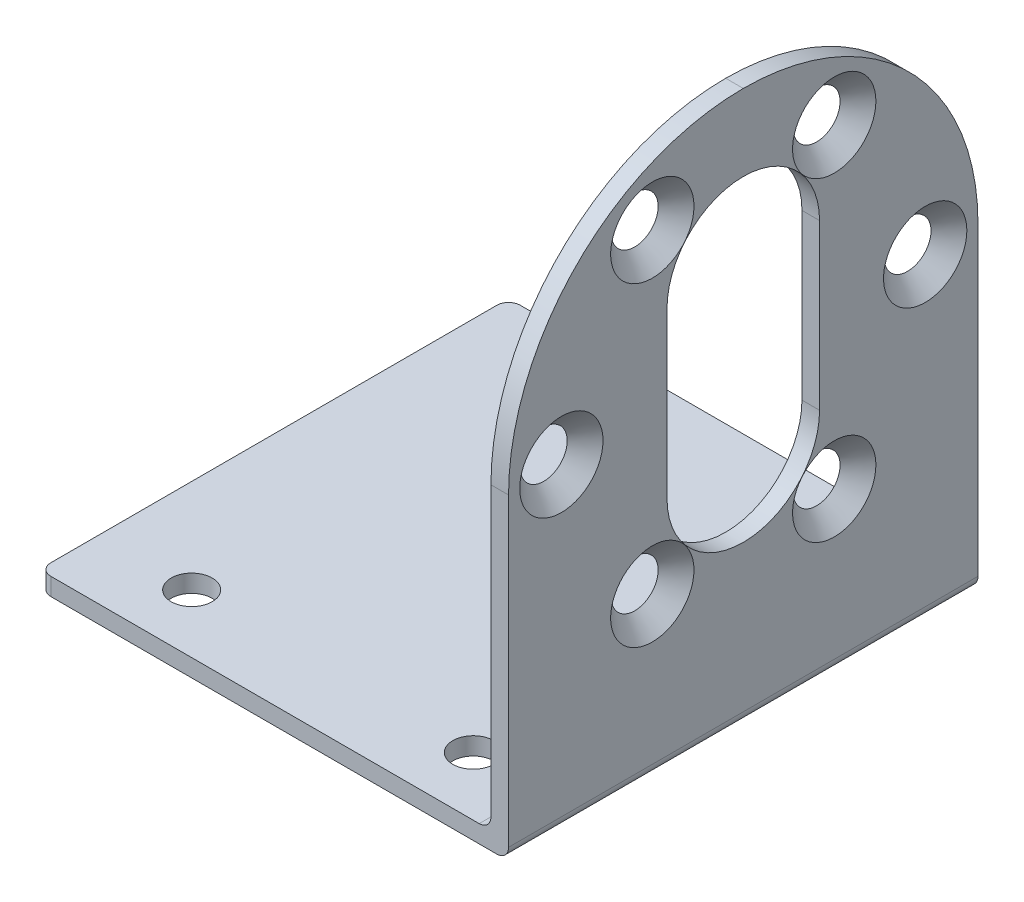
ISO-10303-21;
HEADER;
FILE_DESCRIPTION(('STEP AP214'),'2;1');
FILE_NAME('part.step','',(''),(''),'','','');
FILE_SCHEMA(('AUTOMOTIVE_DESIGN { 1 0 10303 214 1 1 1 1 }'));
ENDSEC;
DATA;
#1=APPLICATION_CONTEXT('core data for automotive mechanical design processes');
#2=APPLICATION_PROTOCOL_DEFINITION('international standard','automotive_design',2000,#1);
#3=PRODUCT_CONTEXT('',#1,'mechanical');
#4=PRODUCT('Part','Part','',(#3));
#5=PRODUCT_RELATED_PRODUCT_CATEGORY('part','',(#4));
#6=PRODUCT_DEFINITION_FORMATION('','',#4);
#7=PRODUCT_DEFINITION_CONTEXT('part definition',#1,'design');
#8=PRODUCT_DEFINITION('design','',#6,#7);
#9=PRODUCT_DEFINITION_SHAPE('','',#8);
#10=(LENGTH_UNIT() NAMED_UNIT(*) SI_UNIT(.MILLI.,.METRE.));
#11=(NAMED_UNIT(*) PLANE_ANGLE_UNIT() SI_UNIT($,.RADIAN.));
#12=(NAMED_UNIT(*) SI_UNIT($,.STERADIAN.) SOLID_ANGLE_UNIT());
#13=UNCERTAINTY_MEASURE_WITH_UNIT(LENGTH_MEASURE(1.E-05),#10,'distance_accuracy_value','');
#14=(GEOMETRIC_REPRESENTATION_CONTEXT(3) GLOBAL_UNCERTAINTY_ASSIGNED_CONTEXT((#13)) GLOBAL_UNIT_ASSIGNED_CONTEXT((#10,
#11,#12)) REPRESENTATION_CONTEXT('',''));
#15=CARTESIAN_POINT('',(0.,0.,0.));
#16=DIRECTION('',(0.,0.,1.));
#17=DIRECTION('',(1.,0.,0.));
#18=AXIS2_PLACEMENT_3D('',#15,#16,#17);
#19=CARTESIAN_POINT('',(20.,1.5,20.));
#20=DIRECTION('',(-1.,0.,0.));
#21=DIRECTION('',(0.,0.,1.));
#22=AXIS2_PLACEMENT_3D('',#19,#20,#21);
#23=PLANE('',#22);
#24=CARTESIAN_POINT('',(20.,27.,-15.5));
#25=DIRECTION('',(1.,0.,0.));
#26=DIRECTION('',(0.,0.,-1.));
#27=AXIS2_PLACEMENT_3D('',#24,#25,#26);
#28=CIRCLE('',#27,3.55);
#29=CARTESIAN_POINT('',(20.,27.,-19.05));
#30=VERTEX_POINT('',#29);
#31=EDGE_CURVE('E303',#30,#30,#28,.T.);
#32=ORIENTED_EDGE('',*,*,#31,.F.);
#33=EDGE_LOOP('',(#32));
#34=FACE_BOUND('',#33,.T.);
#35=CARTESIAN_POINT('',(20.,40.4233937586587,-7.75000000000017));
#36=DIRECTION('',(1.,0.,0.));
#37=DIRECTION('',(0.,0.,-1.));
#38=AXIS2_PLACEMENT_3D('',#35,#36,#37);
#39=CIRCLE('',#38,3.55);
#40=CARTESIAN_POINT('',(20.,40.4233937586587,-11.3000000000002));
#41=VERTEX_POINT('',#40);
#42=EDGE_CURVE('E298',#41,#41,#39,.T.);
#43=ORIENTED_EDGE('',*,*,#42,.F.);
#44=EDGE_LOOP('',(#43));
#45=FACE_BOUND('',#44,.T.);
#46=CARTESIAN_POINT('',(20.,40.4233937586589,7.74999999999987));
#47=DIRECTION('',(1.,0.,0.));
#48=DIRECTION('',(0.,0.,-1.));
#49=AXIS2_PLACEMENT_3D('',#46,#47,#48);
#50=CIRCLE('',#49,3.55);
#51=CARTESIAN_POINT('',(20.,40.4233937586589,4.19999999999987));
#52=VERTEX_POINT('',#51);
#53=EDGE_CURVE('E293',#52,#52,#50,.T.);
#54=ORIENTED_EDGE('',*,*,#53,.F.);
#55=EDGE_LOOP('',(#54));
#56=FACE_BOUND('',#55,.T.);
#57=CARTESIAN_POINT('',(20.,27.0000000000001,15.5));
#58=DIRECTION('',(1.,0.,0.));
#59=DIRECTION('',(0.,0.,-1.));
#60=AXIS2_PLACEMENT_3D('',#57,#58,#59);
#61=CIRCLE('',#60,3.55);
#62=CARTESIAN_POINT('',(20.,27.0000000000001,11.95));
#63=VERTEX_POINT('',#62);
#64=EDGE_CURVE('E288',#63,#63,#61,.T.);
#65=ORIENTED_EDGE('',*,*,#64,.F.);
#66=EDGE_LOOP('',(#65));
#67=FACE_BOUND('',#66,.T.);
#68=CARTESIAN_POINT('',(20.,13.5766062413412,7.75000000000007));
#69=DIRECTION('',(1.,0.,0.));
#70=DIRECTION('',(0.,0.,-1.));
#71=AXIS2_PLACEMENT_3D('',#68,#69,#70);
#72=CIRCLE('',#71,3.55);
#73=CARTESIAN_POINT('',(20.,13.5766062413412,4.20000000000007));
#74=VERTEX_POINT('',#73);
#75=EDGE_CURVE('E283',#74,#74,#72,.T.);
#76=ORIENTED_EDGE('',*,*,#75,.F.);
#77=EDGE_LOOP('',(#76));
#78=FACE_BOUND('',#77,.T.);
#79=CARTESIAN_POINT('',(20.,13.5766062413412,-7.74999999999997));
#80=DIRECTION('',(1.,0.,0.));
#81=DIRECTION('',(0.,0.,-1.));
#82=AXIS2_PLACEMENT_3D('',#79,#80,#81);
#83=CIRCLE('',#82,3.55);
#84=CARTESIAN_POINT('',(20.,13.5766062413412,-11.3));
#85=VERTEX_POINT('',#84);
#86=EDGE_CURVE('E282',#85,#85,#83,.T.);
#87=ORIENTED_EDGE('',*,*,#86,.F.);
#88=EDGE_LOOP('',(#87));
#89=FACE_BOUND('',#88,.T.);
#90=DIRECTION('',(0.,1.,0.));
#91=VECTOR('',#90,1.);
#92=CARTESIAN_POINT('',(20.,20.,-6.5));
#93=LINE('',#92,#91);
#94=CARTESIAN_POINT('',(20.,20.,-6.5));
#95=VERTEX_POINT('',#94);
#96=CARTESIAN_POINT('',(20.,34.,-6.5));
#97=VERTEX_POINT('',#96);
#98=EDGE_CURVE('E187',#95,#97,#93,.T.);
#99=ORIENTED_EDGE('',*,*,#98,.F.);
#100=CARTESIAN_POINT('',(20.,20.,0.));
#101=DIRECTION('',(1.,0.,0.));
#102=DIRECTION('',(0.,0.,-1.));
#103=AXIS2_PLACEMENT_3D('',#100,#101,#102);
#104=CIRCLE('',#103,6.5);
#105=CARTESIAN_POINT('',(20.,20.,6.5));
#106=VERTEX_POINT('',#105);
#107=EDGE_CURVE('E163',#106,#95,#104,.T.);
#108=ORIENTED_EDGE('',*,*,#107,.F.);
#109=DIRECTION('',(0.,-1.,0.));
#110=VECTOR('',#109,1.);
#111=CARTESIAN_POINT('',(20.,20.,6.5));
#112=LINE('',#111,#110);
#113=CARTESIAN_POINT('',(20.,34.,6.50000000000001));
#114=VERTEX_POINT('',#113);
#115=EDGE_CURVE('E174',#114,#106,#112,.T.);
#116=ORIENTED_EDGE('',*,*,#115,.F.);
#117=CARTESIAN_POINT('',(20.,34.,0.));
#118=DIRECTION('',(1.,0.,0.));
#119=DIRECTION('',(0.,0.,-1.));
#120=AXIS2_PLACEMENT_3D('',#117,#118,#119);
#121=CIRCLE('',#120,6.5);
#122=EDGE_CURVE('E181',#97,#114,#121,.T.);
#123=ORIENTED_EDGE('',*,*,#122,.F.);
#124=EDGE_LOOP('',(#99,#108,#116,#123));
#125=FACE_BOUND('',#124,.T.);
#126=DIRECTION('',(0.,-1.,0.));
#127=VECTOR('',#126,1.);
#128=CARTESIAN_POINT('',(20.,1.5,20.));
#129=LINE('',#128,#127);
#130=CARTESIAN_POINT('',(20.,27.,20.));
#131=VERTEX_POINT('',#130);
#132=CARTESIAN_POINT('',(20.,1.,20.));
#133=VERTEX_POINT('',#132);
#134=EDGE_CURVE('E248',#131,#133,#129,.T.);
#135=ORIENTED_EDGE('',*,*,#134,.T.);
#136=DIRECTION('',(0.,0.,-1.));
#137=VECTOR('',#136,1.);
#138=CARTESIAN_POINT('',(20.,1.,-20.));
#139=LINE('',#138,#137);
#140=CARTESIAN_POINT('',(20.,1.,-20.));
#141=VERTEX_POINT('',#140);
#142=EDGE_CURVE('E339',#133,#141,#139,.T.);
#143=ORIENTED_EDGE('',*,*,#142,.T.);
#144=DIRECTION('',(0.,-1.,0.));
#145=VECTOR('',#144,1.);
#146=CARTESIAN_POINT('',(20.,1.5,-20.));
#147=LINE('',#146,#145);
#148=CARTESIAN_POINT('',(20.,27.,-20.));
#149=VERTEX_POINT('',#148);
#150=EDGE_CURVE('E261',#149,#141,#147,.T.);
#151=ORIENTED_EDGE('',*,*,#150,.F.);
#152=CARTESIAN_POINT('',(20.,27.,0.));
#153=DIRECTION('',(-1.,0.,0.));
#154=DIRECTION('',(0.,0.,1.));
#155=AXIS2_PLACEMENT_3D('',#152,#153,#154);
#156=CIRCLE('',#155,20.);
#157=CARTESIAN_POINT('',(20.,47.,0.));
#158=VERTEX_POINT('',#157);
#159=EDGE_CURVE('E310',#149,#158,#156,.F.);
#160=ORIENTED_EDGE('',*,*,#159,.T.);
#161=CARTESIAN_POINT('',(20.,27.,0.));
#162=DIRECTION('',(-1.,0.,0.));
#163=DIRECTION('',(0.,0.,1.));
#164=AXIS2_PLACEMENT_3D('',#161,#162,#163);
#165=CIRCLE('',#164,20.);
#166=EDGE_CURVE('E307',#158,#131,#165,.F.);
#167=ORIENTED_EDGE('',*,*,#166,.T.);
#168=EDGE_LOOP('',(#135,#143,#151,#160,#167));
#169=FACE_BOUND('',#168,.T.);
#170=ADVANCED_FACE('F49',(#34,#45,#56,#67,#78,#89,#125,#169),#23,.F.);
#171=CARTESIAN_POINT('',(-20.,1.5,-20.));
#172=DIRECTION('',(0.,0.,1.));
#173=DIRECTION('',(1.,0.,0.));
#174=AXIS2_PLACEMENT_3D('',#171,#172,#173);
#175=PLANE('',#174);
#176=ORIENTED_EDGE('',*,*,#150,.T.);
#177=CARTESIAN_POINT('',(19.,1.,-20.));
#178=DIRECTION('',(0.,0.,1.));
#179=DIRECTION('',(1.,0.,0.));
#180=AXIS2_PLACEMENT_3D('',#177,#178,#179);
#181=CIRCLE('',#180,1.);
#182=CARTESIAN_POINT('',(19.,0.,-20.));
#183=VERTEX_POINT('',#182);
#184=EDGE_CURVE('E346',#141,#183,#181,.F.);
#185=ORIENTED_EDGE('',*,*,#184,.T.);
#186=DIRECTION('',(-1.,0.,0.));
#187=VECTOR('',#186,1.);
#188=CARTESIAN_POINT('',(-20.,0.,-20.));
#189=LINE('',#188,#187);
#190=CARTESIAN_POINT('',(-19.,0.,-20.));
#191=VERTEX_POINT('',#190);
#192=EDGE_CURVE('E231',#183,#191,#189,.T.);
#193=ORIENTED_EDGE('',*,*,#192,.T.);
#194=DIRECTION('',(0.,-1.,0.));
#195=VECTOR('',#194,1.);
#196=CARTESIAN_POINT('',(-19.,1.5,-20.));
#197=LINE('',#196,#195);
#198=CARTESIAN_POINT('',(-19.,1.5,-20.));
#199=VERTEX_POINT('',#198);
#200=EDGE_CURVE('E343',#191,#199,#197,.F.);
#201=ORIENTED_EDGE('',*,*,#200,.T.);
#202=DIRECTION('',(-1.,0.,0.));
#203=VECTOR('',#202,1.);
#204=CARTESIAN_POINT('',(-20.,1.5,-20.));
#205=LINE('',#204,#203);
#206=CARTESIAN_POINT('',(17.5,1.5,-20.));
#207=VERTEX_POINT('',#206);
#208=EDGE_CURVE('E235',#207,#199,#205,.T.);
#209=ORIENTED_EDGE('',*,*,#208,.F.);
#210=CARTESIAN_POINT('',(17.5,2.5,-20.));
#211=DIRECTION('',(0.,0.,1.));
#212=DIRECTION('',(1.,0.,0.));
#213=AXIS2_PLACEMENT_3D('',#210,#211,#212);
#214=CIRCLE('',#213,1.);
#215=CARTESIAN_POINT('',(18.5,2.5,-20.));
#216=VERTEX_POINT('',#215);
#217=EDGE_CURVE('E58',#207,#216,#214,.T.);
#218=ORIENTED_EDGE('',*,*,#217,.T.);
#219=DIRECTION('',(0.,-1.,0.));
#220=VECTOR('',#219,1.);
#221=CARTESIAN_POINT('',(18.5,47.,-20.));
#222=LINE('',#221,#220);
#223=CARTESIAN_POINT('',(18.5,27.,-20.));
#224=VERTEX_POINT('',#223);
#225=EDGE_CURVE('E189',#224,#216,#222,.T.);
#226=ORIENTED_EDGE('',*,*,#225,.F.);
#227=DIRECTION('',(1.,0.,0.));
#228=VECTOR('',#227,1.);
#229=CARTESIAN_POINT('',(-20.,27.,-20.));
#230=LINE('',#229,#228);
#231=EDGE_CURVE('E277',#224,#149,#230,.T.);
#232=ORIENTED_EDGE('',*,*,#231,.T.);
#233=EDGE_LOOP('',(#176,#185,#193,#201,#209,#218,#226,#232));
#234=FACE_BOUND('',#233,.T.);
#235=ADVANCED_FACE('F372',(#234),#175,.F.);
#236=CARTESIAN_POINT('',(-20.,1.5,20.));
#237=DIRECTION('',(1.,0.,0.));
#238=DIRECTION('',(0.,0.,-1.));
#239=AXIS2_PLACEMENT_3D('',#236,#237,#238);
#240=PLANE('',#239);
#241=DIRECTION('',(0.,0.,1.));
#242=VECTOR('',#241,1.);
#243=CARTESIAN_POINT('',(-20.,1.5,20.));
#244=LINE('',#243,#242);
#245=CARTESIAN_POINT('',(-20.,1.5,-19.));
#246=VERTEX_POINT('',#245);
#247=CARTESIAN_POINT('',(-20.,1.5,19.));
#248=VERTEX_POINT('',#247);
#249=EDGE_CURVE('E239',#246,#248,#244,.T.);
#250=ORIENTED_EDGE('',*,*,#249,.F.);
#251=DIRECTION('',(0.,-1.,0.));
#252=VECTOR('',#251,1.);
#253=CARTESIAN_POINT('',(-20.,1.5,-19.));
#254=LINE('',#253,#252);
#255=CARTESIAN_POINT('',(-20.,0.,-19.));
#256=VERTEX_POINT('',#255);
#257=EDGE_CURVE('E365',#246,#256,#254,.T.);
#258=ORIENTED_EDGE('',*,*,#257,.T.);
#259=DIRECTION('',(0.,0.,1.));
#260=VECTOR('',#259,1.);
#261=CARTESIAN_POINT('',(-20.,0.,20.));
#262=LINE('',#261,#260);
#263=CARTESIAN_POINT('',(-20.,0.,19.));
#264=VERTEX_POINT('',#263);
#265=EDGE_CURVE('E252',#256,#264,#262,.T.);
#266=ORIENTED_EDGE('',*,*,#265,.T.);
#267=DIRECTION('',(0.,-1.,0.));
#268=VECTOR('',#267,1.);
#269=CARTESIAN_POINT('',(-20.,1.5,19.));
#270=LINE('',#269,#268);
#271=EDGE_CURVE('E362',#264,#248,#270,.F.);
#272=ORIENTED_EDGE('',*,*,#271,.T.);
#273=EDGE_LOOP('',(#250,#258,#266,#272));
#274=FACE_BOUND('',#273,.T.);
#275=ADVANCED_FACE('F395',(#274),#240,.F.);
#276=CARTESIAN_POINT('',(-20.,1.5,20.));
#277=DIRECTION('',(0.,0.,-1.));
#278=DIRECTION('',(-1.,0.,0.));
#279=AXIS2_PLACEMENT_3D('',#276,#277,#278);
#280=PLANE('',#279);
#281=DIRECTION('',(1.,0.,0.));
#282=VECTOR('',#281,1.);
#283=CARTESIAN_POINT('',(-20.,0.,20.));
#284=LINE('',#283,#282);
#285=CARTESIAN_POINT('',(-19.,0.,20.));
#286=VERTEX_POINT('',#285);
#287=CARTESIAN_POINT('',(19.,0.,20.));
#288=VERTEX_POINT('',#287);
#289=EDGE_CURVE('E240',#286,#288,#284,.T.);
#290=ORIENTED_EDGE('',*,*,#289,.T.);
#291=CARTESIAN_POINT('',(19.,1.,20.));
#292=DIRECTION('',(0.,0.,-1.));
#293=DIRECTION('',(-1.,0.,0.));
#294=AXIS2_PLACEMENT_3D('',#291,#292,#293);
#295=CIRCLE('',#294,1.);
#296=EDGE_CURVE('E359',#288,#133,#295,.F.);
#297=ORIENTED_EDGE('',*,*,#296,.T.);
#298=ORIENTED_EDGE('',*,*,#134,.F.);
#299=DIRECTION('',(-1.,0.,0.));
#300=VECTOR('',#299,1.);
#301=CARTESIAN_POINT('',(-20.,27.,20.));
#302=LINE('',#301,#300);
#303=CARTESIAN_POINT('',(18.5,27.,20.));
#304=VERTEX_POINT('',#303);
#305=EDGE_CURVE('E319',#131,#304,#302,.T.);
#306=ORIENTED_EDGE('',*,*,#305,.T.);
#307=DIRECTION('',(0.,-1.,0.));
#308=VECTOR('',#307,1.);
#309=CARTESIAN_POINT('',(18.5,47.,20.));
#310=LINE('',#309,#308);
#311=CARTESIAN_POINT('',(18.5,2.5,20.));
#312=VERTEX_POINT('',#311);
#313=EDGE_CURVE('E194',#304,#312,#310,.T.);
#314=ORIENTED_EDGE('',*,*,#313,.T.);
#315=CARTESIAN_POINT('',(17.5,2.5,20.));
#316=DIRECTION('',(0.,0.,-1.));
#317=DIRECTION('',(-1.,0.,0.));
#318=AXIS2_PLACEMENT_3D('',#315,#316,#317);
#319=CIRCLE('',#318,1.);
#320=CARTESIAN_POINT('',(17.5,1.5,20.));
#321=VERTEX_POINT('',#320);
#322=EDGE_CURVE('E11',#312,#321,#319,.T.);
#323=ORIENTED_EDGE('',*,*,#322,.T.);
#324=DIRECTION('',(1.,0.,0.));
#325=VECTOR('',#324,1.);
#326=CARTESIAN_POINT('',(-20.,1.5,20.));
#327=LINE('',#326,#325);
#328=CARTESIAN_POINT('',(-19.,1.5,20.));
#329=VERTEX_POINT('',#328);
#330=EDGE_CURVE('E244',#329,#321,#327,.T.);
#331=ORIENTED_EDGE('',*,*,#330,.F.);
#332=DIRECTION('',(0.,-1.,0.));
#333=VECTOR('',#332,1.);
#334=CARTESIAN_POINT('',(-19.,1.5,20.));
#335=LINE('',#334,#333);
#336=EDGE_CURVE('E356',#329,#286,#335,.T.);
#337=ORIENTED_EDGE('',*,*,#336,.T.);
#338=EDGE_LOOP('',(#290,#297,#298,#306,#314,#323,#331,#337));
#339=FACE_BOUND('',#338,.T.);
#340=ADVANCED_FACE('F385',(#339),#280,.F.);
#341=CARTESIAN_POINT('',(0.,1.5,0.));
#342=DIRECTION('',(0.,-1.,0.));
#343=DIRECTION('',(0.,0.,-1.));
#344=AXIS2_PLACEMENT_3D('',#341,#342,#343);
#345=PLANE('',#344);
#346=CARTESIAN_POINT('',(12.,1.5,-15.));
#347=DIRECTION('',(0.,1.,0.));
#348=DIRECTION('',(0.,0.,1.));
#349=AXIS2_PLACEMENT_3D('',#346,#347,#348);
#350=CIRCLE('',#349,1.75);
#351=CARTESIAN_POINT('',(12.,1.5,-13.25));
#352=VERTEX_POINT('',#351);
#353=EDGE_CURVE('E211',#352,#352,#350,.T.);
#354=ORIENTED_EDGE('',*,*,#353,.F.);
#355=EDGE_LOOP('',(#354));
#356=FACE_BOUND('',#355,.T.);
#357=CARTESIAN_POINT('',(-12.,1.5,15.));
#358=DIRECTION('',(0.,1.,0.));
#359=DIRECTION('',(0.,0.,1.));
#360=AXIS2_PLACEMENT_3D('',#357,#358,#359);
#361=CIRCLE('',#360,1.75);
#362=CARTESIAN_POINT('',(-12.,1.5,16.75));
#363=VERTEX_POINT('',#362);
#364=EDGE_CURVE('E220',#363,#363,#361,.T.);
#365=ORIENTED_EDGE('',*,*,#364,.F.);
#366=EDGE_LOOP('',(#365));
#367=FACE_BOUND('',#366,.T.);
#368=CARTESIAN_POINT('',(12.,1.5,15.));
#369=DIRECTION('',(0.,1.,0.));
#370=DIRECTION('',(0.,0.,1.));
#371=AXIS2_PLACEMENT_3D('',#368,#369,#370);
#372=CIRCLE('',#371,1.75);
#373=CARTESIAN_POINT('',(12.,1.5,16.75));
#374=VERTEX_POINT('',#373);
#375=EDGE_CURVE('E203',#374,#374,#372,.T.);
#376=ORIENTED_EDGE('',*,*,#375,.F.);
#377=EDGE_LOOP('',(#376));
#378=FACE_BOUND('',#377,.T.);
#379=CARTESIAN_POINT('',(-12.,1.5,-15.));
#380=DIRECTION('',(0.,1.,0.));
#381=DIRECTION('',(0.,0.,1.));
#382=AXIS2_PLACEMENT_3D('',#379,#380,#381);
#383=CIRCLE('',#382,1.75);
#384=CARTESIAN_POINT('',(-12.,1.5,-13.25));
#385=VERTEX_POINT('',#384);
#386=EDGE_CURVE('E215',#385,#385,#383,.T.);
#387=ORIENTED_EDGE('',*,*,#386,.F.);
#388=EDGE_LOOP('',(#387));
#389=FACE_BOUND('',#388,.T.);
#390=ORIENTED_EDGE('',*,*,#330,.T.);
#391=DIRECTION('',(0.,0.,-1.));
#392=VECTOR('',#391,1.);
#393=CARTESIAN_POINT('',(17.5,1.5,0.));
#394=LINE('',#393,#392);
#395=EDGE_CURVE('E332',#321,#207,#394,.T.);
#396=ORIENTED_EDGE('',*,*,#395,.T.);
#397=ORIENTED_EDGE('',*,*,#208,.T.);
#398=CARTESIAN_POINT('',(-19.,1.5,-19.));
#399=DIRECTION('',(0.,-1.,0.));
#400=DIRECTION('',(0.,0.,-1.));
#401=AXIS2_PLACEMENT_3D('',#398,#399,#400);
#402=CIRCLE('',#401,1.);
#403=EDGE_CURVE('E329',#199,#246,#402,.F.);
#404=ORIENTED_EDGE('',*,*,#403,.T.);
#405=ORIENTED_EDGE('',*,*,#249,.T.);
#406=CARTESIAN_POINT('',(-19.,1.5,19.));
#407=DIRECTION('',(0.,-1.,0.));
#408=DIRECTION('',(0.,0.,-1.));
#409=AXIS2_PLACEMENT_3D('',#406,#407,#408);
#410=CIRCLE('',#409,1.);
#411=EDGE_CURVE('E322',#248,#329,#410,.F.);
#412=ORIENTED_EDGE('',*,*,#411,.T.);
#413=EDGE_LOOP('',(#390,#396,#397,#404,#405,#412));
#414=FACE_BOUND('',#413,.T.);
#415=ADVANCED_FACE('F387',(#356,#367,#378,#389,#414),#345,.F.);
#416=CARTESIAN_POINT('',(0.,0.,0.));
#417=DIRECTION('',(0.,-1.,0.));
#418=DIRECTION('',(0.,0.,-1.));
#419=AXIS2_PLACEMENT_3D('',#416,#417,#418);
#420=PLANE('',#419);
#421=ORIENTED_EDGE('',*,*,#192,.F.);
#422=DIRECTION('',(0.,0.,-1.));
#423=VECTOR('',#422,1.);
#424=CARTESIAN_POINT('',(19.,0.,20.));
#425=LINE('',#424,#423);
#426=EDGE_CURVE('E65',#183,#288,#425,.F.);
#427=ORIENTED_EDGE('',*,*,#426,.T.);
#428=ORIENTED_EDGE('',*,*,#289,.F.);
#429=CARTESIAN_POINT('',(-19.,0.,19.));
#430=DIRECTION('',(0.,-1.,0.));
#431=DIRECTION('',(0.,0.,-1.));
#432=AXIS2_PLACEMENT_3D('',#429,#430,#431);
#433=CIRCLE('',#432,1.);
#434=EDGE_CURVE('E73',#286,#264,#433,.T.);
#435=ORIENTED_EDGE('',*,*,#434,.T.);
#436=ORIENTED_EDGE('',*,*,#265,.F.);
#437=CARTESIAN_POINT('',(-19.,0.,-19.));
#438=DIRECTION('',(0.,-1.,0.));
#439=DIRECTION('',(0.,0.,-1.));
#440=AXIS2_PLACEMENT_3D('',#437,#438,#439);
#441=CIRCLE('',#440,1.);
#442=EDGE_CURVE('E351',#256,#191,#441,.T.);
#443=ORIENTED_EDGE('',*,*,#442,.T.);
#444=EDGE_LOOP('',(#421,#427,#428,#435,#436,#443));
#445=FACE_BOUND('',#444,.T.);
#446=CARTESIAN_POINT('',(12.,0.,-15.));
#447=DIRECTION('',(0.,1.,0.));
#448=DIRECTION('',(0.,0.,1.));
#449=AXIS2_PLACEMENT_3D('',#446,#447,#448);
#450=CIRCLE('',#449,1.75);
#451=CARTESIAN_POINT('',(12.,0.,-13.25));
#452=VERTEX_POINT('',#451);
#453=EDGE_CURVE('E216',#452,#452,#450,.T.);
#454=ORIENTED_EDGE('',*,*,#453,.T.);
#455=EDGE_LOOP('',(#454));
#456=FACE_BOUND('',#455,.T.);
#457=CARTESIAN_POINT('',(-12.,0.,15.));
#458=DIRECTION('',(0.,1.,0.));
#459=DIRECTION('',(0.,0.,1.));
#460=AXIS2_PLACEMENT_3D('',#457,#458,#459);
#461=CIRCLE('',#460,1.75);
#462=CARTESIAN_POINT('',(-12.,0.,16.75));
#463=VERTEX_POINT('',#462);
#464=EDGE_CURVE('E207',#463,#463,#461,.T.);
#465=ORIENTED_EDGE('',*,*,#464,.T.);
#466=EDGE_LOOP('',(#465));
#467=FACE_BOUND('',#466,.T.);
#468=CARTESIAN_POINT('',(12.,0.,15.));
#469=DIRECTION('',(0.,1.,0.));
#470=DIRECTION('',(0.,0.,1.));
#471=AXIS2_PLACEMENT_3D('',#468,#469,#470);
#472=CIRCLE('',#471,1.75);
#473=CARTESIAN_POINT('',(12.,0.,16.75));
#474=VERTEX_POINT('',#473);
#475=EDGE_CURVE('E201',#474,#474,#472,.T.);
#476=ORIENTED_EDGE('',*,*,#475,.T.);
#477=EDGE_LOOP('',(#476));
#478=FACE_BOUND('',#477,.T.);
#479=CARTESIAN_POINT('',(-12.,0.,-15.));
#480=DIRECTION('',(0.,1.,0.));
#481=DIRECTION('',(0.,0.,1.));
#482=AXIS2_PLACEMENT_3D('',#479,#480,#481);
#483=CIRCLE('',#482,1.75);
#484=CARTESIAN_POINT('',(-12.,0.,-13.25));
#485=VERTEX_POINT('',#484);
#486=EDGE_CURVE('E227',#485,#485,#483,.T.);
#487=ORIENTED_EDGE('',*,*,#486,.T.);
#488=EDGE_LOOP('',(#487));
#489=FACE_BOUND('',#488,.T.);
#490=ADVANCED_FACE('F391',(#445,#456,#467,#478,#489),#420,.T.);
#491=CARTESIAN_POINT('',(-12.,0.,-15.));
#492=DIRECTION('',(0.,1.,0.));
#493=DIRECTION('',(0.,0.,1.));
#494=AXIS2_PLACEMENT_3D('',#491,#492,#493);
#495=CYLINDRICAL_SURFACE('',#494,1.75);
#496=ORIENTED_EDGE('',*,*,#486,.F.);
#497=EDGE_LOOP('',(#496));
#498=FACE_BOUND('',#497,.T.);
#499=ORIENTED_EDGE('',*,*,#386,.T.);
#500=EDGE_LOOP('',(#499));
#501=FACE_BOUND('',#500,.T.);
#502=ADVANCED_FACE('F439',(#498,#501),#495,.F.);
#503=CARTESIAN_POINT('',(12.,0.,15.));
#504=DIRECTION('',(0.,1.,0.));
#505=DIRECTION('',(0.,0.,1.));
#506=AXIS2_PLACEMENT_3D('',#503,#504,#505);
#507=CYLINDRICAL_SURFACE('',#506,1.75);
#508=ORIENTED_EDGE('',*,*,#475,.F.);
#509=EDGE_LOOP('',(#508));
#510=FACE_BOUND('',#509,.T.);
#511=ORIENTED_EDGE('',*,*,#375,.T.);
#512=EDGE_LOOP('',(#511));
#513=FACE_BOUND('',#512,.T.);
#514=ADVANCED_FACE('F445',(#510,#513),#507,.F.);
#515=CARTESIAN_POINT('',(-12.,0.,15.));
#516=DIRECTION('',(0.,1.,0.));
#517=DIRECTION('',(0.,0.,1.));
#518=AXIS2_PLACEMENT_3D('',#515,#516,#517);
#519=CYLINDRICAL_SURFACE('',#518,1.75);
#520=ORIENTED_EDGE('',*,*,#464,.F.);
#521=EDGE_LOOP('',(#520));
#522=FACE_BOUND('',#521,.T.);
#523=ORIENTED_EDGE('',*,*,#364,.T.);
#524=EDGE_LOOP('',(#523));
#525=FACE_BOUND('',#524,.T.);
#526=ADVANCED_FACE('F447',(#522,#525),#519,.F.);
#527=CARTESIAN_POINT('',(12.,0.,-15.));
#528=DIRECTION('',(0.,1.,0.));
#529=DIRECTION('',(0.,0.,1.));
#530=AXIS2_PLACEMENT_3D('',#527,#528,#529);
#531=CYLINDRICAL_SURFACE('',#530,1.75);
#532=ORIENTED_EDGE('',*,*,#453,.F.);
#533=EDGE_LOOP('',(#532));
#534=FACE_BOUND('',#533,.T.);
#535=ORIENTED_EDGE('',*,*,#353,.T.);
#536=EDGE_LOOP('',(#535));
#537=FACE_BOUND('',#536,.T.);
#538=ADVANCED_FACE('F450',(#534,#537),#531,.F.);
#539=CARTESIAN_POINT('',(18.5,47.,0.));
#540=DIRECTION('',(-1.,0.,0.));
#541=DIRECTION('',(0.,0.,1.));
#542=AXIS2_PLACEMENT_3D('',#539,#540,#541);
#543=PLANE('',#542);
#544=CARTESIAN_POINT('',(18.5,27.,-15.5));
#545=DIRECTION('',(-1.,0.,0.));
#546=DIRECTION('',(0.,0.,1.));
#547=AXIS2_PLACEMENT_3D('',#544,#545,#546);
#548=CIRCLE('',#547,1.99670452931415);
#549=CARTESIAN_POINT('',(18.5,27.,-13.5032954706859));
#550=VERTEX_POINT('',#549);
#551=EDGE_CURVE('E299',#550,#550,#548,.T.);
#552=ORIENTED_EDGE('',*,*,#551,.F.);
#553=EDGE_LOOP('',(#552));
#554=FACE_BOUND('',#553,.T.);
#555=CARTESIAN_POINT('',(18.5,40.4233937586587,-7.75000000000017));
#556=DIRECTION('',(-1.,0.,0.));
#557=DIRECTION('',(0.,0.,1.));
#558=AXIS2_PLACEMENT_3D('',#555,#556,#557);
#559=CIRCLE('',#558,1.99670452931415);
#560=CARTESIAN_POINT('',(18.5,40.4233937586587,-5.75329547068602));
#561=VERTEX_POINT('',#560);
#562=EDGE_CURVE('E294',#561,#561,#559,.T.);
#563=ORIENTED_EDGE('',*,*,#562,.F.);
#564=EDGE_LOOP('',(#563));
#565=FACE_BOUND('',#564,.T.);
#566=CARTESIAN_POINT('',(18.5,40.4233937586589,7.74999999999987));
#567=DIRECTION('',(-1.,0.,0.));
#568=DIRECTION('',(0.,0.,1.));
#569=AXIS2_PLACEMENT_3D('',#566,#567,#568);
#570=CIRCLE('',#569,1.99670452931415);
#571=CARTESIAN_POINT('',(18.5,40.4233937586589,9.74670452931402));
#572=VERTEX_POINT('',#571);
#573=EDGE_CURVE('E289',#572,#572,#570,.T.);
#574=ORIENTED_EDGE('',*,*,#573,.F.);
#575=EDGE_LOOP('',(#574));
#576=FACE_BOUND('',#575,.T.);
#577=CARTESIAN_POINT('',(18.5,27.0000000000001,15.5));
#578=DIRECTION('',(-1.,0.,0.));
#579=DIRECTION('',(0.,0.,1.));
#580=AXIS2_PLACEMENT_3D('',#577,#578,#579);
#581=CIRCLE('',#580,1.99670452931415);
#582=CARTESIAN_POINT('',(18.5,27.0000000000001,17.4967045293142));
#583=VERTEX_POINT('',#582);
#584=EDGE_CURVE('E284',#583,#583,#581,.T.);
#585=ORIENTED_EDGE('',*,*,#584,.F.);
#586=EDGE_LOOP('',(#585));
#587=FACE_BOUND('',#586,.T.);
#588=CARTESIAN_POINT('',(18.5,13.5766062413412,7.75000000000007));
#589=DIRECTION('',(-1.,0.,0.));
#590=DIRECTION('',(0.,0.,1.));
#591=AXIS2_PLACEMENT_3D('',#588,#589,#590);
#592=CIRCLE('',#591,1.99670452931415);
#593=CARTESIAN_POINT('',(18.5,13.5766062413412,9.74670452931422));
#594=VERTEX_POINT('',#593);
#595=EDGE_CURVE('E278',#594,#594,#592,.T.);
#596=ORIENTED_EDGE('',*,*,#595,.F.);
#597=EDGE_LOOP('',(#596));
#598=FACE_BOUND('',#597,.T.);
#599=CARTESIAN_POINT('',(18.5,13.5766062413412,-7.74999999999997));
#600=DIRECTION('',(-1.,0.,0.));
#601=DIRECTION('',(0.,0.,1.));
#602=AXIS2_PLACEMENT_3D('',#599,#600,#601);
#603=CIRCLE('',#602,1.99670452931415);
#604=CARTESIAN_POINT('',(18.5,13.5766062413412,-5.75329547068582));
#605=VERTEX_POINT('',#604);
#606=EDGE_CURVE('E171',#605,#605,#603,.T.);
#607=ORIENTED_EDGE('',*,*,#606,.F.);
#608=EDGE_LOOP('',(#607));
#609=FACE_BOUND('',#608,.T.);
#610=CARTESIAN_POINT('',(18.5,20.,0.));
#611=DIRECTION('',(-1.,0.,0.));
#612=DIRECTION('',(0.,0.,1.));
#613=AXIS2_PLACEMENT_3D('',#610,#611,#612);
#614=CIRCLE('',#613,6.5);
#615=CARTESIAN_POINT('',(18.5,20.,-6.5));
#616=VERTEX_POINT('',#615);
#617=CARTESIAN_POINT('',(18.5,20.,6.5));
#618=VERTEX_POINT('',#617);
#619=EDGE_CURVE('E166',#616,#618,#614,.T.);
#620=ORIENTED_EDGE('',*,*,#619,.F.);
#621=DIRECTION('',(0.,-1.,0.));
#622=VECTOR('',#621,1.);
#623=CARTESIAN_POINT('',(18.5,47.,-6.5));
#624=LINE('',#623,#622);
#625=CARTESIAN_POINT('',(18.5,34.,-6.5));
#626=VERTEX_POINT('',#625);
#627=EDGE_CURVE('E265',#626,#616,#624,.T.);
#628=ORIENTED_EDGE('',*,*,#627,.F.);
#629=CARTESIAN_POINT('',(18.5,34.,0.));
#630=DIRECTION('',(-1.,0.,0.));
#631=DIRECTION('',(0.,0.,1.));
#632=AXIS2_PLACEMENT_3D('',#629,#630,#631);
#633=CIRCLE('',#632,6.5);
#634=CARTESIAN_POINT('',(18.5,34.,6.50000000000001));
#635=VERTEX_POINT('',#634);
#636=EDGE_CURVE('E268',#635,#626,#633,.T.);
#637=ORIENTED_EDGE('',*,*,#636,.F.);
#638=DIRECTION('',(0.,1.,0.));
#639=VECTOR('',#638,1.);
#640=CARTESIAN_POINT('',(18.5,47.,6.50000000000001));
#641=LINE('',#640,#639);
#642=EDGE_CURVE('E272',#618,#635,#641,.T.);
#643=ORIENTED_EDGE('',*,*,#642,.F.);
#644=EDGE_LOOP('',(#620,#628,#637,#643));
#645=FACE_BOUND('',#644,.T.);
#646=ORIENTED_EDGE('',*,*,#225,.T.);
#647=DIRECTION('',(0.,0.,-1.));
#648=VECTOR('',#647,1.);
#649=CARTESIAN_POINT('',(18.5,2.5,0.));
#650=LINE('',#649,#648);
#651=EDGE_CURVE('E336',#216,#312,#650,.F.);
#652=ORIENTED_EDGE('',*,*,#651,.T.);
#653=ORIENTED_EDGE('',*,*,#313,.F.);
#654=CARTESIAN_POINT('',(18.5,27.,0.));
#655=DIRECTION('',(-1.,0.,0.));
#656=DIRECTION('',(0.,0.,1.));
#657=AXIS2_PLACEMENT_3D('',#654,#655,#656);
#658=CIRCLE('',#657,20.);
#659=CARTESIAN_POINT('',(18.5,47.,0.));
#660=VERTEX_POINT('',#659);
#661=EDGE_CURVE('E313',#304,#660,#658,.T.);
#662=ORIENTED_EDGE('',*,*,#661,.T.);
#663=CARTESIAN_POINT('',(18.5,27.,0.));
#664=DIRECTION('',(-1.,0.,0.));
#665=DIRECTION('',(0.,0.,1.));
#666=AXIS2_PLACEMENT_3D('',#663,#664,#665);
#667=CIRCLE('',#666,20.);
#668=EDGE_CURVE('E316',#660,#224,#667,.T.);
#669=ORIENTED_EDGE('',*,*,#668,.T.);
#670=EDGE_LOOP('',(#646,#652,#653,#662,#669));
#671=FACE_BOUND('',#670,.T.);
#672=ADVANCED_FACE('F378',(#554,#565,#576,#587,#598,#609,#645,#671),#543,.T.);
#673=CARTESIAN_POINT('',(-20.,20.,0.));
#674=DIRECTION('',(1.,0.,0.));
#675=DIRECTION('',(0.,0.,-1.));
#676=AXIS2_PLACEMENT_3D('',#673,#674,#675);
#677=CYLINDRICAL_SURFACE('',#676,6.5);
#678=ORIENTED_EDGE('',*,*,#619,.T.);
#679=DIRECTION('',(1.,0.,0.));
#680=VECTOR('',#679,1.);
#681=CARTESIAN_POINT('',(-20.,20.,6.5));
#682=LINE('',#681,#680);
#683=EDGE_CURVE('E158',#618,#106,#682,.T.);
#684=ORIENTED_EDGE('',*,*,#683,.T.);
#685=ORIENTED_EDGE('',*,*,#107,.T.);
#686=DIRECTION('',(1.,0.,0.));
#687=VECTOR('',#686,1.);
#688=CARTESIAN_POINT('',(-20.,20.,-6.5));
#689=LINE('',#688,#687);
#690=EDGE_CURVE('E182',#616,#95,#689,.T.);
#691=ORIENTED_EDGE('',*,*,#690,.F.);
#692=EDGE_LOOP('',(#678,#684,#685,#691));
#693=FACE_BOUND('',#692,.T.);
#694=ADVANCED_FACE('F160',(#693),#677,.F.);
#695=CARTESIAN_POINT('',(-20.,20.,6.5));
#696=DIRECTION('',(0.,0.,1.));
#697=DIRECTION('',(0.,-1.,0.));
#698=AXIS2_PLACEMENT_3D('',#695,#696,#697);
#699=PLANE('',#698);
#700=ORIENTED_EDGE('',*,*,#642,.T.);
#701=DIRECTION('',(1.,0.,0.));
#702=VECTOR('',#701,1.);
#703=CARTESIAN_POINT('',(-20.,34.,6.50000000000001));
#704=LINE('',#703,#702);
#705=EDGE_CURVE('E170',#635,#114,#704,.T.);
#706=ORIENTED_EDGE('',*,*,#705,.T.);
#707=ORIENTED_EDGE('',*,*,#115,.T.);
#708=ORIENTED_EDGE('',*,*,#683,.F.);
#709=EDGE_LOOP('',(#700,#706,#707,#708));
#710=FACE_BOUND('',#709,.T.);
#711=ADVANCED_FACE('F175',(#710),#699,.F.);
#712=CARTESIAN_POINT('',(-20.,34.,0.));
#713=DIRECTION('',(1.,0.,0.));
#714=DIRECTION('',(0.,0.,-1.));
#715=AXIS2_PLACEMENT_3D('',#712,#713,#714);
#716=CYLINDRICAL_SURFACE('',#715,6.5);
#717=ORIENTED_EDGE('',*,*,#636,.T.);
#718=DIRECTION('',(1.,0.,0.));
#719=VECTOR('',#718,1.);
#720=CARTESIAN_POINT('',(-20.,34.,-6.5));
#721=LINE('',#720,#719);
#722=EDGE_CURVE('E523',#626,#97,#721,.T.);
#723=ORIENTED_EDGE('',*,*,#722,.T.);
#724=ORIENTED_EDGE('',*,*,#122,.T.);
#725=ORIENTED_EDGE('',*,*,#705,.F.);
#726=EDGE_LOOP('',(#717,#723,#724,#725));
#727=FACE_BOUND('',#726,.T.);
#728=ADVANCED_FACE('F463',(#727),#716,.F.);
#729=CARTESIAN_POINT('',(-20.,20.,-6.5));
#730=DIRECTION('',(0.,0.,-1.));
#731=DIRECTION('',(0.,1.,0.));
#732=AXIS2_PLACEMENT_3D('',#729,#730,#731);
#733=PLANE('',#732);
#734=ORIENTED_EDGE('',*,*,#627,.T.);
#735=ORIENTED_EDGE('',*,*,#690,.T.);
#736=ORIENTED_EDGE('',*,*,#98,.T.);
#737=ORIENTED_EDGE('',*,*,#722,.F.);
#738=EDGE_LOOP('',(#734,#735,#736,#737));
#739=FACE_BOUND('',#738,.T.);
#740=ADVANCED_FACE('F466',(#739),#733,.F.);
#741=CARTESIAN_POINT('',(20.,13.5766062413412,-7.74999999999997));
#742=DIRECTION('',(1.,0.,0.));
#743=DIRECTION('',(0.,0.,-1.));
#744=AXIS2_PLACEMENT_3D('',#741,#742,#743);
#745=CONICAL_SURFACE('',#744,3.55,0.802851455917391);
#746=ORIENTED_EDGE('',*,*,#606,.T.);
#747=EDGE_LOOP('',(#746));
#748=FACE_BOUND('',#747,.T.);
#749=ORIENTED_EDGE('',*,*,#86,.T.);
#750=EDGE_LOOP('',(#749));
#751=FACE_BOUND('',#750,.T.);
#752=ADVANCED_FACE('F470',(#748,#751),#745,.F.);
#753=CARTESIAN_POINT('',(20.,13.5766062413412,7.75000000000007));
#754=DIRECTION('',(1.,0.,0.));
#755=DIRECTION('',(0.,0.,-1.));
#756=AXIS2_PLACEMENT_3D('',#753,#754,#755);
#757=CONICAL_SURFACE('',#756,3.55,0.802851455917391);
#758=ORIENTED_EDGE('',*,*,#595,.T.);
#759=EDGE_LOOP('',(#758));
#760=FACE_BOUND('',#759,.T.);
#761=ORIENTED_EDGE('',*,*,#75,.T.);
#762=EDGE_LOOP('',(#761));
#763=FACE_BOUND('',#762,.T.);
#764=ADVANCED_FACE('F476',(#760,#763),#757,.F.);
#765=CARTESIAN_POINT('',(20.,27.0000000000001,15.5));
#766=DIRECTION('',(1.,0.,0.));
#767=DIRECTION('',(0.,0.,-1.));
#768=AXIS2_PLACEMENT_3D('',#765,#766,#767);
#769=CONICAL_SURFACE('',#768,3.55,0.802851455917392);
#770=ORIENTED_EDGE('',*,*,#584,.T.);
#771=EDGE_LOOP('',(#770));
#772=FACE_BOUND('',#771,.T.);
#773=ORIENTED_EDGE('',*,*,#64,.T.);
#774=EDGE_LOOP('',(#773));
#775=FACE_BOUND('',#774,.T.);
#776=ADVANCED_FACE('F480',(#772,#775),#769,.F.);
#777=CARTESIAN_POINT('',(20.,40.4233937586589,7.74999999999987));
#778=DIRECTION('',(1.,0.,0.));
#779=DIRECTION('',(0.,0.,-1.));
#780=AXIS2_PLACEMENT_3D('',#777,#778,#779);
#781=CONICAL_SURFACE('',#780,3.55,0.80285145591739);
#782=ORIENTED_EDGE('',*,*,#573,.T.);
#783=EDGE_LOOP('',(#782));
#784=FACE_BOUND('',#783,.T.);
#785=ORIENTED_EDGE('',*,*,#53,.T.);
#786=EDGE_LOOP('',(#785));
#787=FACE_BOUND('',#786,.T.);
#788=ADVANCED_FACE('F484',(#784,#787),#781,.F.);
#789=CARTESIAN_POINT('',(20.,40.4233937586587,-7.75000000000017));
#790=DIRECTION('',(1.,0.,0.));
#791=DIRECTION('',(0.,0.,-1.));
#792=AXIS2_PLACEMENT_3D('',#789,#790,#791);
#793=CONICAL_SURFACE('',#792,3.55,0.80285145591739);
#794=ORIENTED_EDGE('',*,*,#562,.T.);
#795=EDGE_LOOP('',(#794));
#796=FACE_BOUND('',#795,.T.);
#797=ORIENTED_EDGE('',*,*,#42,.T.);
#798=EDGE_LOOP('',(#797));
#799=FACE_BOUND('',#798,.T.);
#800=ADVANCED_FACE('F488',(#796,#799),#793,.F.);
#801=CARTESIAN_POINT('',(20.,27.,-15.5));
#802=DIRECTION('',(1.,0.,0.));
#803=DIRECTION('',(0.,0.,-1.));
#804=AXIS2_PLACEMENT_3D('',#801,#802,#803);
#805=CONICAL_SURFACE('',#804,3.55,0.802851455917392);
#806=ORIENTED_EDGE('',*,*,#551,.T.);
#807=EDGE_LOOP('',(#806));
#808=FACE_BOUND('',#807,.T.);
#809=ORIENTED_EDGE('',*,*,#31,.T.);
#810=EDGE_LOOP('',(#809));
#811=FACE_BOUND('',#810,.T.);
#812=ADVANCED_FACE('F422',(#808,#811),#805,.F.);
#813=CARTESIAN_POINT('',(-20.,27.,0.));
#814=DIRECTION('',(-1.,0.,0.));
#815=DIRECTION('',(0.,0.,1.));
#816=AXIS2_PLACEMENT_3D('',#813,#814,#815);
#817=CYLINDRICAL_SURFACE('',#816,20.);
#818=DIRECTION('',(-1.,0.,0.));
#819=VECTOR('',#818,1.);
#820=CARTESIAN_POINT('',(0.,47.,0.));
#821=LINE('',#820,#819);
#822=EDGE_CURVE('E323',#660,#158,#821,.F.);
#823=ORIENTED_EDGE('',*,*,#822,.F.);
#824=ORIENTED_EDGE('',*,*,#661,.F.);
#825=ORIENTED_EDGE('',*,*,#305,.F.);
#826=ORIENTED_EDGE('',*,*,#166,.F.);
#827=EDGE_LOOP('',(#823,#824,#825,#826));
#828=FACE_BOUND('',#827,.T.);
#829=ADVANCED_FACE('F411',(#828),#817,.T.);
#830=CARTESIAN_POINT('',(-20.,27.,0.));
#831=DIRECTION('',(1.,0.,0.));
#832=DIRECTION('',(0.,0.,-1.));
#833=AXIS2_PLACEMENT_3D('',#830,#831,#832);
#834=CYLINDRICAL_SURFACE('',#833,20.);
#835=ORIENTED_EDGE('',*,*,#668,.F.);
#836=ORIENTED_EDGE('',*,*,#822,.T.);
#837=ORIENTED_EDGE('',*,*,#159,.F.);
#838=ORIENTED_EDGE('',*,*,#231,.F.);
#839=EDGE_LOOP('',(#835,#836,#837,#838));
#840=FACE_BOUND('',#839,.T.);
#841=ADVANCED_FACE('F413',(#840),#834,.T.);
#842=CARTESIAN_POINT('',(17.5,2.5,0.));
#843=DIRECTION('',(0.,0.,-1.));
#844=DIRECTION('',(-1.,0.,0.));
#845=AXIS2_PLACEMENT_3D('',#842,#843,#844);
#846=CYLINDRICAL_SURFACE('',#845,1.);
#847=ORIENTED_EDGE('',*,*,#322,.F.);
#848=ORIENTED_EDGE('',*,*,#651,.F.);
#849=ORIENTED_EDGE('',*,*,#217,.F.);
#850=ORIENTED_EDGE('',*,*,#395,.F.);
#851=EDGE_LOOP('',(#847,#848,#849,#850));
#852=FACE_BOUND('',#851,.T.);
#853=ADVANCED_FACE('F382',(#852),#846,.F.);
#854=CARTESIAN_POINT('',(19.,1.,20.));
#855=DIRECTION('',(0.,0.,1.));
#856=DIRECTION('',(1.,0.,0.));
#857=AXIS2_PLACEMENT_3D('',#854,#855,#856);
#858=CYLINDRICAL_SURFACE('',#857,1.);
#859=ORIENTED_EDGE('',*,*,#296,.F.);
#860=ORIENTED_EDGE('',*,*,#426,.F.);
#861=ORIENTED_EDGE('',*,*,#184,.F.);
#862=ORIENTED_EDGE('',*,*,#142,.F.);
#863=EDGE_LOOP('',(#859,#860,#861,#862));
#864=FACE_BOUND('',#863,.T.);
#865=ADVANCED_FACE('F404',(#864),#858,.T.);
#866=CARTESIAN_POINT('',(-19.,1.5,-19.));
#867=DIRECTION('',(0.,-1.,0.));
#868=DIRECTION('',(0.,0.,-1.));
#869=AXIS2_PLACEMENT_3D('',#866,#867,#868);
#870=CYLINDRICAL_SURFACE('',#869,1.);
#871=ORIENTED_EDGE('',*,*,#403,.F.);
#872=ORIENTED_EDGE('',*,*,#200,.F.);
#873=ORIENTED_EDGE('',*,*,#442,.F.);
#874=ORIENTED_EDGE('',*,*,#257,.F.);
#875=EDGE_LOOP('',(#871,#872,#873,#874));
#876=FACE_BOUND('',#875,.T.);
#877=ADVANCED_FACE('F399',(#876),#870,.T.);
#878=CARTESIAN_POINT('',(-19.,1.5,19.));
#879=DIRECTION('',(0.,-1.,0.));
#880=DIRECTION('',(0.,0.,-1.));
#881=AXIS2_PLACEMENT_3D('',#878,#879,#880);
#882=CYLINDRICAL_SURFACE('',#881,1.);
#883=ORIENTED_EDGE('',*,*,#411,.F.);
#884=ORIENTED_EDGE('',*,*,#271,.F.);
#885=ORIENTED_EDGE('',*,*,#434,.F.);
#886=ORIENTED_EDGE('',*,*,#336,.F.);
#887=EDGE_LOOP('',(#883,#884,#885,#886));
#888=FACE_BOUND('',#887,.T.);
#889=ADVANCED_FACE('F51',(#888),#882,.T.);
#890=CLOSED_SHELL('',(#170,#235,#275,#340,#415,#490,#502,#514,#526,#538,#672,#694,#711,#728,
#740,#752,#764,#776,#788,#800,#812,#829,#841,#853,#865,#877,#889));
#891=MANIFOLD_SOLID_BREP('B2',#890);
#892=ADVANCED_BREP_SHAPE_REPRESENTATION('',(#18,#891),#14);
#893=SHAPE_DEFINITION_REPRESENTATION(#9,#892);
ENDSEC;
END-ISO-10303-21;
